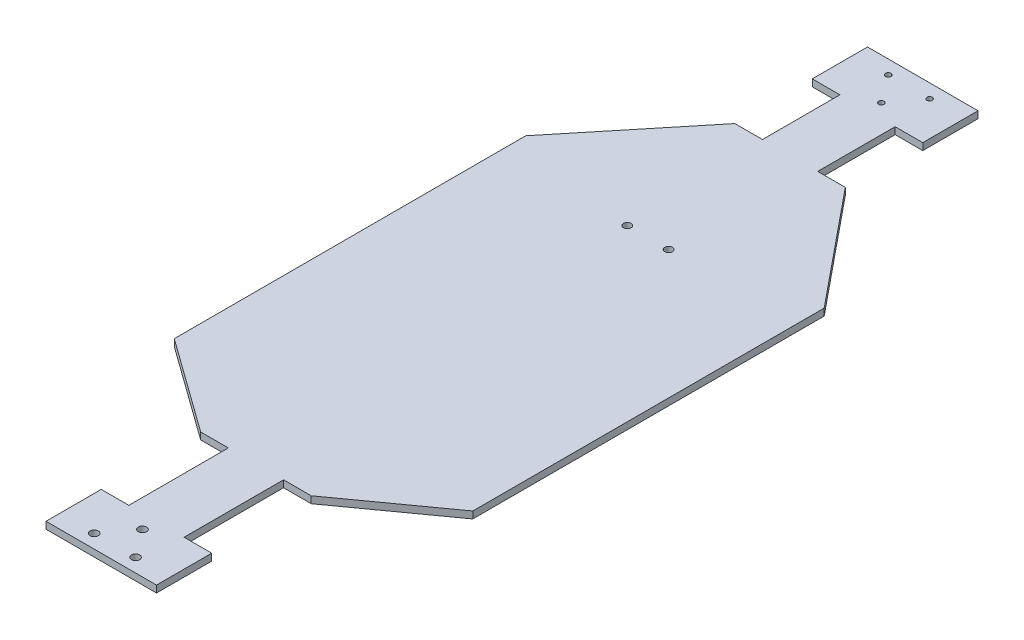
ISO-10303-21;
HEADER;
FILE_DESCRIPTION(('STEP AP214'),'2;1');
FILE_NAME('part.step','',(''),(''),'','','');
FILE_SCHEMA(('AUTOMOTIVE_DESIGN { 1 0 10303 214 1 1 1 1 }'));
ENDSEC;
DATA;
#1=APPLICATION_CONTEXT('core data for automotive mechanical design processes');
#2=APPLICATION_PROTOCOL_DEFINITION('international standard','automotive_design',2000,#1);
#3=PRODUCT_CONTEXT('',#1,'mechanical');
#4=PRODUCT('Part','Part','',(#3));
#5=PRODUCT_RELATED_PRODUCT_CATEGORY('part','',(#4));
#6=PRODUCT_DEFINITION_FORMATION('','',#4);
#7=PRODUCT_DEFINITION_CONTEXT('part definition',#1,'design');
#8=PRODUCT_DEFINITION('design','',#6,#7);
#9=PRODUCT_DEFINITION_SHAPE('','',#8);
#10=(LENGTH_UNIT() NAMED_UNIT(*) SI_UNIT(.MILLI.,.METRE.));
#11=(NAMED_UNIT(*) PLANE_ANGLE_UNIT() SI_UNIT($,.RADIAN.));
#12=(NAMED_UNIT(*) SI_UNIT($,.STERADIAN.) SOLID_ANGLE_UNIT());
#13=UNCERTAINTY_MEASURE_WITH_UNIT(LENGTH_MEASURE(1.E-05),#10,'distance_accuracy_value','');
#14=(GEOMETRIC_REPRESENTATION_CONTEXT(3) GLOBAL_UNCERTAINTY_ASSIGNED_CONTEXT((#13)) GLOBAL_UNIT_ASSIGNED_CONTEXT((#10,
#11,#12)) REPRESENTATION_CONTEXT('',''));
#15=CARTESIAN_POINT('',(0.,0.,0.));
#16=DIRECTION('',(0.,0.,1.));
#17=DIRECTION('',(1.,0.,0.));
#18=AXIS2_PLACEMENT_3D('',#15,#16,#17);
#19=CARTESIAN_POINT('',(-25.3999999999999,3.175,126.133371864142));
#20=DIRECTION('',(0.,-1.,0.));
#21=DIRECTION('',(0.,0.,-1.));
#22=AXIS2_PLACEMENT_3D('',#19,#20,#21);
#23=PLANE('',#22);
#24=CARTESIAN_POINT('',(-9.52499999999995,3.175,-99.829892630849));
#25=DIRECTION('',(0.,1.,0.));
#26=DIRECTION('',(0.,0.,1.));
#27=AXIS2_PLACEMENT_3D('',#24,#25,#26);
#28=CIRCLE('',#27,1.776231011829);
#29=CARTESIAN_POINT('',(-9.52499999999995,3.175,-98.05366161902));
#30=VERTEX_POINT('',#29);
#31=EDGE_CURVE('E464',#30,#30,#28,.T.);
#32=ORIENTED_EDGE('',*,*,#31,.F.);
#33=EDGE_LOOP('',(#32));
#34=FACE_BOUND('',#33,.T.);
#35=CARTESIAN_POINT('',(4.37150315946155E-13,3.175,132.579330515667));
#36=DIRECTION('',(0.,1.,0.));
#37=DIRECTION('',(0.,0.,1.));
#38=AXIS2_PLACEMENT_3D('',#35,#36,#37);
#39=CIRCLE('',#38,1.90499999999991);
#40=CARTESIAN_POINT('',(4.37150315946155E-13,3.175,134.484330515667));
#41=VERTEX_POINT('',#40);
#42=EDGE_CURVE('E476',#41,#41,#39,.T.);
#43=ORIENTED_EDGE('',*,*,#42,.F.);
#44=EDGE_LOOP('',(#43));
#45=FACE_BOUND('',#44,.T.);
#46=CARTESIAN_POINT('',(0.,3.175,-207.145669484333));
#47=DIRECTION('',(0.,1.,0.));
#48=DIRECTION('',(0.,0.,1.));
#49=AXIS2_PLACEMENT_3D('',#46,#47,#48);
#50=CIRCLE('',#49,1.25643098330284);
#51=CARTESIAN_POINT('',(0.,3.175,-205.88923850103));
#52=VERTEX_POINT('',#51);
#53=EDGE_CURVE('E488',#52,#52,#50,.T.);
#54=ORIENTED_EDGE('',*,*,#53,.F.);
#55=EDGE_LOOP('',(#54));
#56=FACE_BOUND('',#55,.T.);
#57=CARTESIAN_POINT('',(-9.525,3.175,-219.845669484333));
#58=DIRECTION('',(0.,1.,0.));
#59=DIRECTION('',(0.,0.,1.));
#60=AXIS2_PLACEMENT_3D('',#57,#58,#59);
#61=CIRCLE('',#60,1.25643098330284);
#62=CARTESIAN_POINT('',(-9.525,3.175,-218.58923850103));
#63=VERTEX_POINT('',#62);
#64=EDGE_CURVE('E229',#63,#63,#61,.T.);
#65=ORIENTED_EDGE('',*,*,#64,.F.);
#66=EDGE_LOOP('',(#65));
#67=FACE_BOUND('',#66,.T.);
#68=DIRECTION('',(0.,0.,1.));
#69=VECTOR('',#68,1.);
#70=CARTESIAN_POINT('',(-25.3999999999999,3.175,151.533371864142));
#71=LINE('',#70,#69);
#72=CARTESIAN_POINT('',(-25.3999999999999,3.175,126.133371864142));
#73=VERTEX_POINT('',#72);
#74=CARTESIAN_POINT('',(-25.3999999999999,3.175,151.533371864142));
#75=VERTEX_POINT('',#74);
#76=EDGE_CURVE('E274',#73,#75,#71,.T.);
#77=ORIENTED_EDGE('',*,*,#76,.T.);
#78=DIRECTION('',(1.,0.,0.));
#79=VECTOR('',#78,1.);
#80=CARTESIAN_POINT('',(25.4000000000001,3.175,151.533371864142));
#81=LINE('',#80,#79);
#82=CARTESIAN_POINT('',(25.4000000000001,3.175,151.533371864142));
#83=VERTEX_POINT('',#82);
#84=EDGE_CURVE('E140',#75,#83,#81,.T.);
#85=ORIENTED_EDGE('',*,*,#84,.T.);
#86=DIRECTION('',(0.,0.,-1.));
#87=VECTOR('',#86,1.);
#88=CARTESIAN_POINT('',(25.4000000000001,3.175,151.533371864142));
#89=LINE('',#88,#87);
#90=CARTESIAN_POINT('',(25.3999999999999,3.175,126.133371864142));
#91=VERTEX_POINT('',#90);
#92=EDGE_CURVE('E337',#83,#91,#89,.T.);
#93=ORIENTED_EDGE('',*,*,#92,.T.);
#94=DIRECTION('',(-1.,0.,0.));
#95=VECTOR('',#94,1.);
#96=CARTESIAN_POINT('',(25.3999999999999,3.175,126.133371864142));
#97=LINE('',#96,#95);
#98=CARTESIAN_POINT('',(12.6999999999999,3.175,126.133371864142));
#99=VERTEX_POINT('',#98);
#100=EDGE_CURVE('E356',#91,#99,#97,.T.);
#101=ORIENTED_EDGE('',*,*,#100,.T.);
#102=DIRECTION('',(0.,0.,-1.));
#103=VECTOR('',#102,1.);
#104=CARTESIAN_POINT('',(12.6999999999999,3.175,126.133371864142));
#105=LINE('',#104,#103);
#106=CARTESIAN_POINT('',(12.6999999999999,3.175,80.4133718641424));
#107=VERTEX_POINT('',#106);
#108=EDGE_CURVE('E353',#99,#107,#105,.T.);
#109=ORIENTED_EDGE('',*,*,#108,.T.);
#110=DIRECTION('',(1.,0.,0.));
#111=VECTOR('',#110,1.);
#112=CARTESIAN_POINT('',(12.6999999999999,3.175,80.4133718641424));
#113=LINE('',#112,#111);
#114=CARTESIAN_POINT('',(25.3999999999999,3.175,80.4133718641424));
#115=VERTEX_POINT('',#114);
#116=EDGE_CURVE('E355',#107,#115,#113,.T.);
#117=ORIENTED_EDGE('',*,*,#116,.T.);
#118=DIRECTION('',(0.81178928975706,0.,-0.583950467964303));
#119=VECTOR('',#118,1.);
#120=CARTESIAN_POINT('',(25.3999999999999,3.175,80.4133718641424));
#121=LINE('',#120,#119);
#122=CARTESIAN_POINT('',(68.6199109866888,3.175,49.3236696908044));
#123=VERTEX_POINT('',#122);
#124=EDGE_CURVE('E358',#115,#123,#121,.T.);
#125=ORIENTED_EDGE('',*,*,#124,.T.);
#126=DIRECTION('',(0.,0.,-1.));
#127=VECTOR('',#126,1.);
#128=CARTESIAN_POINT('',(68.6199109866888,3.175,49.3236696908044));
#129=LINE('',#128,#127);
#130=CARTESIAN_POINT('',(68.6199109866888,3.175,-112.251832625839));
#131=VERTEX_POINT('',#130);
#132=EDGE_CURVE('E364',#123,#131,#129,.T.);
#133=ORIENTED_EDGE('',*,*,#132,.T.);
#134=DIRECTION('',(-0.632396488026637,0.,-0.77464487472104));
#135=VECTOR('',#134,1.);
#136=CARTESIAN_POINT('',(68.6199109866888,3.175,-112.251832625839));
#137=LINE('',#136,#135);
#138=CARTESIAN_POINT('',(25.4,3.175,-165.193433608177));
#139=VERTEX_POINT('',#138);
#140=EDGE_CURVE('E366',#131,#139,#137,.T.);
#141=ORIENTED_EDGE('',*,*,#140,.T.);
#142=DIRECTION('',(-1.,0.,0.));
#143=VECTOR('',#142,1.);
#144=CARTESIAN_POINT('',(25.4,3.175,-165.193433608177));
#145=LINE('',#144,#143);
#146=CARTESIAN_POINT('',(12.7,3.175,-165.193433608177));
#147=VERTEX_POINT('',#146);
#148=EDGE_CURVE('E368',#139,#147,#145,.T.);
#149=ORIENTED_EDGE('',*,*,#148,.T.);
#150=DIRECTION('',(0.,0.,-1.));
#151=VECTOR('',#150,1.);
#152=CARTESIAN_POINT('',(12.7,3.175,-165.193433608177));
#153=LINE('',#152,#151);
#154=CARTESIAN_POINT('',(12.7000000000001,3.175,-200.795669484333));
#155=VERTEX_POINT('',#154);
#156=EDGE_CURVE('E370',#147,#155,#153,.T.);
#157=ORIENTED_EDGE('',*,*,#156,.T.);
#158=DIRECTION('',(1.,0.,0.));
#159=VECTOR('',#158,1.);
#160=CARTESIAN_POINT('',(12.7000000000001,3.175,-200.795669484333));
#161=LINE('',#160,#159);
#162=CARTESIAN_POINT('',(25.3999999999999,3.175,-200.795669484333));
#163=VERTEX_POINT('',#162);
#164=EDGE_CURVE('E372',#155,#163,#161,.T.);
#165=ORIENTED_EDGE('',*,*,#164,.T.);
#166=DIRECTION('',(0.,0.,-1.));
#167=VECTOR('',#166,1.);
#168=CARTESIAN_POINT('',(25.3999999999999,3.175,-200.795669484333));
#169=LINE('',#168,#167);
#170=CARTESIAN_POINT('',(25.3999999999999,3.175,-226.195669484333));
#171=VERTEX_POINT('',#170);
#172=EDGE_CURVE('E374',#163,#171,#169,.T.);
#173=ORIENTED_EDGE('',*,*,#172,.T.);
#174=DIRECTION('',(-1.,0.,0.));
#175=VECTOR('',#174,1.);
#176=CARTESIAN_POINT('',(-25.3999999999999,3.175,-226.195669484333));
#177=LINE('',#176,#175);
#178=CARTESIAN_POINT('',(-25.3999999999999,3.175,-226.195669484333));
#179=VERTEX_POINT('',#178);
#180=EDGE_CURVE('E376',#171,#179,#177,.T.);
#181=ORIENTED_EDGE('',*,*,#180,.T.);
#182=DIRECTION('',(0.,0.,1.));
#183=VECTOR('',#182,1.);
#184=CARTESIAN_POINT('',(-25.3999999999999,3.175,-200.795669484333));
#185=LINE('',#184,#183);
#186=CARTESIAN_POINT('',(-25.3999999999999,3.175,-200.795669484333));
#187=VERTEX_POINT('',#186);
#188=EDGE_CURVE('E378',#179,#187,#185,.T.);
#189=ORIENTED_EDGE('',*,*,#188,.T.);
#190=DIRECTION('',(1.,0.,0.));
#191=VECTOR('',#190,1.);
#192=CARTESIAN_POINT('',(-12.7000000000001,3.175,-200.795669484333));
#193=LINE('',#192,#191);
#194=CARTESIAN_POINT('',(-12.7000000000001,3.175,-200.795669484333));
#195=VERTEX_POINT('',#194);
#196=EDGE_CURVE('E380',#187,#195,#193,.T.);
#197=ORIENTED_EDGE('',*,*,#196,.T.);
#198=DIRECTION('',(0.,0.,1.));
#199=VECTOR('',#198,1.);
#200=CARTESIAN_POINT('',(-12.7,3.175,-165.193433608177));
#201=LINE('',#200,#199);
#202=CARTESIAN_POINT('',(-12.7,3.175,-165.193433608177));
#203=VERTEX_POINT('',#202);
#204=EDGE_CURVE('E382',#195,#203,#201,.T.);
#205=ORIENTED_EDGE('',*,*,#204,.T.);
#206=DIRECTION('',(-1.,0.,0.));
#207=VECTOR('',#206,1.);
#208=CARTESIAN_POINT('',(-25.4,3.175,-165.193433608177));
#209=LINE('',#208,#207);
#210=CARTESIAN_POINT('',(-25.4,3.175,-165.193433608177));
#211=VERTEX_POINT('',#210);
#212=EDGE_CURVE('E384',#203,#211,#209,.T.);
#213=ORIENTED_EDGE('',*,*,#212,.T.);
#214=DIRECTION('',(-0.632396488026636,0.,0.77464487472104));
#215=VECTOR('',#214,1.);
#216=CARTESIAN_POINT('',(-68.6199109866888,3.175,-112.251832625839));
#217=LINE('',#216,#215);
#218=CARTESIAN_POINT('',(-68.6199109866888,3.175,-112.251832625839));
#219=VERTEX_POINT('',#218);
#220=EDGE_CURVE('E386',#211,#219,#217,.T.);
#221=ORIENTED_EDGE('',*,*,#220,.T.);
#222=DIRECTION('',(0.,0.,1.));
#223=VECTOR('',#222,1.);
#224=CARTESIAN_POINT('',(-68.6199109866886,3.175,0.));
#225=LINE('',#224,#223);
#226=CARTESIAN_POINT('',(-68.6199109866888,3.175,49.3236696908044));
#227=VERTEX_POINT('',#226);
#228=EDGE_CURVE('E388',#219,#227,#225,.T.);
#229=ORIENTED_EDGE('',*,*,#228,.T.);
#230=DIRECTION('',(0.81178928975706,0.,0.583950467964303));
#231=VECTOR('',#230,1.);
#232=CARTESIAN_POINT('',(-25.3999999999999,3.175,80.4133718641424));
#233=LINE('',#232,#231);
#234=CARTESIAN_POINT('',(-25.3999999999999,3.175,80.4133718641424));
#235=VERTEX_POINT('',#234);
#236=EDGE_CURVE('E207',#227,#235,#233,.T.);
#237=ORIENTED_EDGE('',*,*,#236,.T.);
#238=DIRECTION('',(1.,0.,0.));
#239=VECTOR('',#238,1.);
#240=CARTESIAN_POINT('',(-12.6999999999999,3.175,80.4133718641424));
#241=LINE('',#240,#239);
#242=CARTESIAN_POINT('',(-12.6999999999999,3.175,80.4133718641424));
#243=VERTEX_POINT('',#242);
#244=EDGE_CURVE('E201',#235,#243,#241,.T.);
#245=ORIENTED_EDGE('',*,*,#244,.T.);
#246=DIRECTION('',(0.,0.,1.));
#247=VECTOR('',#246,1.);
#248=CARTESIAN_POINT('',(-12.6999999999999,3.175,126.133371864142));
#249=LINE('',#248,#247);
#250=CARTESIAN_POINT('',(-12.6999999999999,3.175,126.133371864142));
#251=VERTEX_POINT('',#250);
#252=EDGE_CURVE('E205',#243,#251,#249,.T.);
#253=ORIENTED_EDGE('',*,*,#252,.T.);
#254=DIRECTION('',(-1.,0.,0.));
#255=VECTOR('',#254,1.);
#256=CARTESIAN_POINT('',(-25.3999999999999,3.175,126.133371864142));
#257=LINE('',#256,#255);
#258=EDGE_CURVE('E49',#251,#73,#257,.T.);
#259=ORIENTED_EDGE('',*,*,#258,.T.);
#260=EDGE_LOOP('',(#77,#85,#93,#101,#109,#117,#125,#133,#141,#149,#157,#165,#173,#181,#189,#197,
#205,#213,#221,#229,#237,#245,#253,#259));
#261=FACE_BOUND('',#260,.T.);
#262=CARTESIAN_POINT('',(9.525,3.175,-219.845669484333));
#263=DIRECTION('',(0.,1.,0.));
#264=DIRECTION('',(0.,0.,1.));
#265=AXIS2_PLACEMENT_3D('',#262,#263,#264);
#266=CIRCLE('',#265,1.25643098330284);
#267=CARTESIAN_POINT('',(9.525,3.175,-218.58923850103));
#268=VERTEX_POINT('',#267);
#269=EDGE_CURVE('E494',#268,#268,#266,.T.);
#270=ORIENTED_EDGE('',*,*,#269,.F.);
#271=EDGE_LOOP('',(#270));
#272=FACE_BOUND('',#271,.T.);
#273=CARTESIAN_POINT('',(9.52500000000044,3.175,145.279330515667));
#274=DIRECTION('',(0.,1.,0.));
#275=DIRECTION('',(0.,0.,1.));
#276=AXIS2_PLACEMENT_3D('',#273,#274,#275);
#277=CIRCLE('',#276,1.90499999999993);
#278=CARTESIAN_POINT('',(9.52500000000044,3.175,147.184330515667));
#279=VERTEX_POINT('',#278);
#280=EDGE_CURVE('E482',#279,#279,#277,.T.);
#281=ORIENTED_EDGE('',*,*,#280,.F.);
#282=EDGE_LOOP('',(#281));
#283=FACE_BOUND('',#282,.T.);
#284=CARTESIAN_POINT('',(-9.52499999999957,3.175,145.279330515667));
#285=DIRECTION('',(0.,1.,0.));
#286=DIRECTION('',(0.,0.,1.));
#287=AXIS2_PLACEMENT_3D('',#284,#285,#286);
#288=CIRCLE('',#287,1.90499999999993);
#289=CARTESIAN_POINT('',(-9.52499999999957,3.175,147.184330515667));
#290=VERTEX_POINT('',#289);
#291=EDGE_CURVE('E470',#290,#290,#288,.T.);
#292=ORIENTED_EDGE('',*,*,#291,.F.);
#293=EDGE_LOOP('',(#292));
#294=FACE_BOUND('',#293,.T.);
#295=CARTESIAN_POINT('',(9.52499999999998,3.175,-99.829892630849));
#296=DIRECTION('',(0.,1.,0.));
#297=DIRECTION('',(0.,0.,1.));
#298=AXIS2_PLACEMENT_3D('',#295,#296,#297);
#299=CIRCLE('',#298,1.776231011829);
#300=CARTESIAN_POINT('',(9.52499999999998,3.175,-98.05366161902));
#301=VERTEX_POINT('',#300);
#302=EDGE_CURVE('E455',#301,#301,#299,.T.);
#303=ORIENTED_EDGE('',*,*,#302,.F.);
#304=EDGE_LOOP('',(#303));
#305=FACE_BOUND('',#304,.T.);
#306=ADVANCED_FACE('F32',(#34,#45,#56,#67,#261,#272,#283,#294,#305),#23,.F.);
#307=CARTESIAN_POINT('',(-25.3999999999999,0.,126.133371864142));
#308=DIRECTION('',(0.,-1.,0.));
#309=DIRECTION('',(0.,0.,-1.));
#310=AXIS2_PLACEMENT_3D('',#307,#308,#309);
#311=PLANE('',#310);
#312=CARTESIAN_POINT('',(-9.52499999999995,0.,-99.829892630849));
#313=DIRECTION('',(0.,1.,0.));
#314=DIRECTION('',(0.,0.,1.));
#315=AXIS2_PLACEMENT_3D('',#312,#313,#314);
#316=CIRCLE('',#315,1.776231011829);
#317=CARTESIAN_POINT('',(-9.52499999999995,0.,-98.05366161902));
#318=VERTEX_POINT('',#317);
#319=EDGE_CURVE('E461',#318,#318,#316,.T.);
#320=ORIENTED_EDGE('',*,*,#319,.T.);
#321=EDGE_LOOP('',(#320));
#322=FACE_BOUND('',#321,.T.);
#323=CARTESIAN_POINT('',(4.37150315946155E-13,0.,132.579330515667));
#324=DIRECTION('',(0.,1.,0.));
#325=DIRECTION('',(0.,0.,1.));
#326=AXIS2_PLACEMENT_3D('',#323,#324,#325);
#327=CIRCLE('',#326,1.90499999999991);
#328=CARTESIAN_POINT('',(4.37150315946155E-13,0.,134.484330515667));
#329=VERTEX_POINT('',#328);
#330=EDGE_CURVE('E473',#329,#329,#327,.T.);
#331=ORIENTED_EDGE('',*,*,#330,.T.);
#332=EDGE_LOOP('',(#331));
#333=FACE_BOUND('',#332,.T.);
#334=CARTESIAN_POINT('',(0.,0.,-207.145669484333));
#335=DIRECTION('',(0.,1.,0.));
#336=DIRECTION('',(0.,0.,1.));
#337=AXIS2_PLACEMENT_3D('',#334,#335,#336);
#338=CIRCLE('',#337,1.25643098330284);
#339=CARTESIAN_POINT('',(0.,0.,-205.88923850103));
#340=VERTEX_POINT('',#339);
#341=EDGE_CURVE('E485',#340,#340,#338,.T.);
#342=ORIENTED_EDGE('',*,*,#341,.T.);
#343=EDGE_LOOP('',(#342));
#344=FACE_BOUND('',#343,.T.);
#345=CARTESIAN_POINT('',(-9.525,0.,-219.845669484333));
#346=DIRECTION('',(0.,1.,0.));
#347=DIRECTION('',(0.,0.,1.));
#348=AXIS2_PLACEMENT_3D('',#345,#346,#347);
#349=CIRCLE('',#348,1.25643098330284);
#350=CARTESIAN_POINT('',(-9.525,0.,-218.58923850103));
#351=VERTEX_POINT('',#350);
#352=EDGE_CURVE('E497',#351,#351,#349,.T.);
#353=ORIENTED_EDGE('',*,*,#352,.T.);
#354=EDGE_LOOP('',(#353));
#355=FACE_BOUND('',#354,.T.);
#356=DIRECTION('',(0.,0.,1.));
#357=VECTOR('',#356,1.);
#358=CARTESIAN_POINT('',(-25.3999999999999,0.,151.533371864142));
#359=LINE('',#358,#357);
#360=CARTESIAN_POINT('',(-25.3999999999999,0.,126.133371864142));
#361=VERTEX_POINT('',#360);
#362=CARTESIAN_POINT('',(-25.3999999999999,0.,151.533371864142));
#363=VERTEX_POINT('',#362);
#364=EDGE_CURVE('E225',#361,#363,#359,.T.);
#365=ORIENTED_EDGE('',*,*,#364,.F.);
#366=DIRECTION('',(-1.,0.,0.));
#367=VECTOR('',#366,1.);
#368=CARTESIAN_POINT('',(-25.3999999999999,0.,126.133371864142));
#369=LINE('',#368,#367);
#370=CARTESIAN_POINT('',(-12.6999999999999,0.,126.133371864142));
#371=VERTEX_POINT('',#370);
#372=EDGE_CURVE('E132',#371,#361,#369,.T.);
#373=ORIENTED_EDGE('',*,*,#372,.F.);
#374=DIRECTION('',(0.,0.,1.));
#375=VECTOR('',#374,1.);
#376=CARTESIAN_POINT('',(-12.6999999999999,0.,126.133371864142));
#377=LINE('',#376,#375);
#378=CARTESIAN_POINT('',(-12.6999999999999,0.,80.4133718641424));
#379=VERTEX_POINT('',#378);
#380=EDGE_CURVE('E126',#379,#371,#377,.T.);
#381=ORIENTED_EDGE('',*,*,#380,.F.);
#382=DIRECTION('',(1.,0.,0.));
#383=VECTOR('',#382,1.);
#384=CARTESIAN_POINT('',(-12.6999999999999,0.,80.4133718641424));
#385=LINE('',#384,#383);
#386=CARTESIAN_POINT('',(-25.3999999999999,0.,80.4133718641424));
#387=VERTEX_POINT('',#386);
#388=EDGE_CURVE('E215',#387,#379,#385,.T.);
#389=ORIENTED_EDGE('',*,*,#388,.F.);
#390=DIRECTION('',(0.81178928975706,0.,0.583950467964303));
#391=VECTOR('',#390,1.);
#392=CARTESIAN_POINT('',(-25.3999999999999,0.,80.4133718641424));
#393=LINE('',#392,#391);
#394=CARTESIAN_POINT('',(-68.6199109866888,0.,49.3236696908044));
#395=VERTEX_POINT('',#394);
#396=EDGE_CURVE('E269',#395,#387,#393,.T.);
#397=ORIENTED_EDGE('',*,*,#396,.F.);
#398=DIRECTION('',(0.,0.,1.));
#399=VECTOR('',#398,1.);
#400=CARTESIAN_POINT('',(-68.6199109866888,0.,49.3236696908044));
#401=LINE('',#400,#399);
#402=CARTESIAN_POINT('',(-68.6199109866888,0.,-112.251832625839));
#403=VERTEX_POINT('',#402);
#404=EDGE_CURVE('E267',#403,#395,#401,.T.);
#405=ORIENTED_EDGE('',*,*,#404,.F.);
#406=DIRECTION('',(-0.632396488026636,0.,0.77464487472104));
#407=VECTOR('',#406,1.);
#408=CARTESIAN_POINT('',(-68.6199109866888,0.,-112.251832625839));
#409=LINE('',#408,#407);
#410=CARTESIAN_POINT('',(-25.4,0.,-165.193433608177));
#411=VERTEX_POINT('',#410);
#412=EDGE_CURVE('E264',#411,#403,#409,.T.);
#413=ORIENTED_EDGE('',*,*,#412,.F.);
#414=DIRECTION('',(-1.,0.,0.));
#415=VECTOR('',#414,1.);
#416=CARTESIAN_POINT('',(-25.4,0.,-165.193433608177));
#417=LINE('',#416,#415);
#418=CARTESIAN_POINT('',(-12.7,0.,-165.193433608177));
#419=VERTEX_POINT('',#418);
#420=EDGE_CURVE('E262',#419,#411,#417,.T.);
#421=ORIENTED_EDGE('',*,*,#420,.F.);
#422=DIRECTION('',(0.,0.,1.));
#423=VECTOR('',#422,1.);
#424=CARTESIAN_POINT('',(-12.7,0.,-165.193433608177));
#425=LINE('',#424,#423);
#426=CARTESIAN_POINT('',(-12.7000000000001,0.,-200.795669484333));
#427=VERTEX_POINT('',#426);
#428=EDGE_CURVE('E260',#427,#419,#425,.T.);
#429=ORIENTED_EDGE('',*,*,#428,.F.);
#430=DIRECTION('',(1.,0.,0.));
#431=VECTOR('',#430,1.);
#432=CARTESIAN_POINT('',(-12.7000000000001,0.,-200.795669484333));
#433=LINE('',#432,#431);
#434=CARTESIAN_POINT('',(-25.3999999999999,0.,-200.795669484333));
#435=VERTEX_POINT('',#434);
#436=EDGE_CURVE('E258',#435,#427,#433,.T.);
#437=ORIENTED_EDGE('',*,*,#436,.F.);
#438=DIRECTION('',(0.,0.,1.));
#439=VECTOR('',#438,1.);
#440=CARTESIAN_POINT('',(-25.3999999999999,0.,-200.795669484333));
#441=LINE('',#440,#439);
#442=CARTESIAN_POINT('',(-25.3999999999999,0.,-226.195669484333));
#443=VERTEX_POINT('',#442);
#444=EDGE_CURVE('E256',#443,#435,#441,.T.);
#445=ORIENTED_EDGE('',*,*,#444,.F.);
#446=DIRECTION('',(-1.,0.,0.));
#447=VECTOR('',#446,1.);
#448=CARTESIAN_POINT('',(-25.3999999999999,0.,-226.195669484333));
#449=LINE('',#448,#447);
#450=CARTESIAN_POINT('',(25.3999999999999,0.,-226.195669484333));
#451=VERTEX_POINT('',#450);
#452=EDGE_CURVE('E254',#451,#443,#449,.T.);
#453=ORIENTED_EDGE('',*,*,#452,.F.);
#454=DIRECTION('',(0.,0.,-1.));
#455=VECTOR('',#454,1.);
#456=CARTESIAN_POINT('',(25.3999999999999,0.,-200.795669484333));
#457=LINE('',#456,#455);
#458=CARTESIAN_POINT('',(25.3999999999999,0.,-200.795669484333));
#459=VERTEX_POINT('',#458);
#460=EDGE_CURVE('E252',#459,#451,#457,.T.);
#461=ORIENTED_EDGE('',*,*,#460,.F.);
#462=DIRECTION('',(1.,0.,0.));
#463=VECTOR('',#462,1.);
#464=CARTESIAN_POINT('',(12.7000000000001,0.,-200.795669484333));
#465=LINE('',#464,#463);
#466=CARTESIAN_POINT('',(12.7000000000001,0.,-200.795669484333));
#467=VERTEX_POINT('',#466);
#468=EDGE_CURVE('E250',#467,#459,#465,.T.);
#469=ORIENTED_EDGE('',*,*,#468,.F.);
#470=DIRECTION('',(0.,0.,-1.));
#471=VECTOR('',#470,1.);
#472=CARTESIAN_POINT('',(12.7,0.,-165.193433608177));
#473=LINE('',#472,#471);
#474=CARTESIAN_POINT('',(12.7,0.,-165.193433608177));
#475=VERTEX_POINT('',#474);
#476=EDGE_CURVE('E248',#475,#467,#473,.T.);
#477=ORIENTED_EDGE('',*,*,#476,.F.);
#478=DIRECTION('',(-1.,0.,0.));
#479=VECTOR('',#478,1.);
#480=CARTESIAN_POINT('',(25.4,0.,-165.193433608177));
#481=LINE('',#480,#479);
#482=CARTESIAN_POINT('',(25.4,0.,-165.193433608177));
#483=VERTEX_POINT('',#482);
#484=EDGE_CURVE('E246',#483,#475,#481,.T.);
#485=ORIENTED_EDGE('',*,*,#484,.F.);
#486=DIRECTION('',(-0.632396488026637,0.,-0.77464487472104));
#487=VECTOR('',#486,1.);
#488=CARTESIAN_POINT('',(68.6199109866888,0.,-112.251832625839));
#489=LINE('',#488,#487);
#490=CARTESIAN_POINT('',(68.6199109866888,0.,-112.251832625839));
#491=VERTEX_POINT('',#490);
#492=EDGE_CURVE('E244',#491,#483,#489,.T.);
#493=ORIENTED_EDGE('',*,*,#492,.F.);
#494=DIRECTION('',(0.,0.,-1.));
#495=VECTOR('',#494,1.);
#496=CARTESIAN_POINT('',(68.6199109866886,0.,0.));
#497=LINE('',#496,#495);
#498=CARTESIAN_POINT('',(68.6199109866888,0.,49.3236696908044));
#499=VERTEX_POINT('',#498);
#500=EDGE_CURVE('E242',#499,#491,#497,.T.);
#501=ORIENTED_EDGE('',*,*,#500,.F.);
#502=DIRECTION('',(0.81178928975706,0.,-0.583950467964303));
#503=VECTOR('',#502,1.);
#504=CARTESIAN_POINT('',(25.3999999999999,0.,80.4133718641424));
#505=LINE('',#504,#503);
#506=CARTESIAN_POINT('',(25.3999999999999,0.,80.4133718641424));
#507=VERTEX_POINT('',#506);
#508=EDGE_CURVE('E239',#507,#499,#505,.T.);
#509=ORIENTED_EDGE('',*,*,#508,.F.);
#510=DIRECTION('',(1.,0.,0.));
#511=VECTOR('',#510,1.);
#512=CARTESIAN_POINT('',(12.6999999999999,0.,80.4133718641424));
#513=LINE('',#512,#511);
#514=CARTESIAN_POINT('',(12.6999999999999,0.,80.4133718641424));
#515=VERTEX_POINT('',#514);
#516=EDGE_CURVE('E237',#515,#507,#513,.T.);
#517=ORIENTED_EDGE('',*,*,#516,.F.);
#518=DIRECTION('',(0.,0.,-1.));
#519=VECTOR('',#518,1.);
#520=CARTESIAN_POINT('',(12.6999999999999,0.,126.133371864142));
#521=LINE('',#520,#519);
#522=CARTESIAN_POINT('',(12.6999999999999,0.,126.133371864142));
#523=VERTEX_POINT('',#522);
#524=EDGE_CURVE('E235',#523,#515,#521,.T.);
#525=ORIENTED_EDGE('',*,*,#524,.F.);
#526=DIRECTION('',(-1.,0.,0.));
#527=VECTOR('',#526,1.);
#528=CARTESIAN_POINT('',(25.3999999999999,0.,126.133371864142));
#529=LINE('',#528,#527);
#530=CARTESIAN_POINT('',(25.3999999999999,0.,126.133371864142));
#531=VERTEX_POINT('',#530);
#532=EDGE_CURVE('E233',#531,#523,#529,.T.);
#533=ORIENTED_EDGE('',*,*,#532,.F.);
#534=DIRECTION('',(0.,0.,-1.));
#535=VECTOR('',#534,1.);
#536=CARTESIAN_POINT('',(25.4000000000001,0.,151.533371864142));
#537=LINE('',#536,#535);
#538=CARTESIAN_POINT('',(25.4000000000001,0.,151.533371864142));
#539=VERTEX_POINT('',#538);
#540=EDGE_CURVE('E231',#539,#531,#537,.T.);
#541=ORIENTED_EDGE('',*,*,#540,.F.);
#542=DIRECTION('',(1.,0.,0.));
#543=VECTOR('',#542,1.);
#544=CARTESIAN_POINT('',(25.4000000000001,0.,151.533371864142));
#545=LINE('',#544,#543);
#546=EDGE_CURVE('E228',#363,#539,#545,.T.);
#547=ORIENTED_EDGE('',*,*,#546,.F.);
#548=EDGE_LOOP('',(#365,#373,#381,#389,#397,#405,#413,#421,#429,#437,#445,#453,#461,#469,#477,
#485,#493,#501,#509,#517,#525,#533,#541,#547));
#549=FACE_BOUND('',#548,.T.);
#550=CARTESIAN_POINT('',(9.525,0.,-219.845669484333));
#551=DIRECTION('',(0.,1.,0.));
#552=DIRECTION('',(0.,0.,1.));
#553=AXIS2_PLACEMENT_3D('',#550,#551,#552);
#554=CIRCLE('',#553,1.25643098330284);
#555=CARTESIAN_POINT('',(9.525,0.,-218.58923850103));
#556=VERTEX_POINT('',#555);
#557=EDGE_CURVE('E491',#556,#556,#554,.T.);
#558=ORIENTED_EDGE('',*,*,#557,.T.);
#559=EDGE_LOOP('',(#558));
#560=FACE_BOUND('',#559,.T.);
#561=CARTESIAN_POINT('',(9.52500000000044,0.,145.279330515667));
#562=DIRECTION('',(0.,1.,0.));
#563=DIRECTION('',(0.,0.,1.));
#564=AXIS2_PLACEMENT_3D('',#561,#562,#563);
#565=CIRCLE('',#564,1.90499999999993);
#566=CARTESIAN_POINT('',(9.52500000000044,0.,147.184330515667));
#567=VERTEX_POINT('',#566);
#568=EDGE_CURVE('E479',#567,#567,#565,.T.);
#569=ORIENTED_EDGE('',*,*,#568,.T.);
#570=EDGE_LOOP('',(#569));
#571=FACE_BOUND('',#570,.T.);
#572=CARTESIAN_POINT('',(-9.52499999999957,0.,145.279330515667));
#573=DIRECTION('',(0.,1.,0.));
#574=DIRECTION('',(0.,0.,1.));
#575=AXIS2_PLACEMENT_3D('',#572,#573,#574);
#576=CIRCLE('',#575,1.90499999999993);
#577=CARTESIAN_POINT('',(-9.52499999999957,0.,147.184330515667));
#578=VERTEX_POINT('',#577);
#579=EDGE_CURVE('E467',#578,#578,#576,.T.);
#580=ORIENTED_EDGE('',*,*,#579,.T.);
#581=EDGE_LOOP('',(#580));
#582=FACE_BOUND('',#581,.T.);
#583=CARTESIAN_POINT('',(9.52499999999998,0.,-99.829892630849));
#584=DIRECTION('',(0.,1.,0.));
#585=DIRECTION('',(0.,0.,1.));
#586=AXIS2_PLACEMENT_3D('',#583,#584,#585);
#587=CIRCLE('',#586,1.776231011829);
#588=CARTESIAN_POINT('',(9.52499999999998,0.,-98.05366161902));
#589=VERTEX_POINT('',#588);
#590=EDGE_CURVE('E458',#589,#589,#587,.T.);
#591=ORIENTED_EDGE('',*,*,#590,.T.);
#592=EDGE_LOOP('',(#591));
#593=FACE_BOUND('',#592,.T.);
#594=ADVANCED_FACE('F341',(#322,#333,#344,#355,#549,#560,#571,#582,#593),#311,.T.);
#595=CARTESIAN_POINT('',(-25.3999999999999,3.175,151.533371864142));
#596=DIRECTION('',(1.,0.,0.));
#597=DIRECTION('',(0.,0.,-1.));
#598=AXIS2_PLACEMENT_3D('',#595,#596,#597);
#599=PLANE('',#598);
#600=ORIENTED_EDGE('',*,*,#364,.T.);
#601=DIRECTION('',(0.,-1.,0.));
#602=VECTOR('',#601,1.);
#603=CARTESIAN_POINT('',(-25.3999999999999,3.175,151.533371864142));
#604=LINE('',#603,#602);
#605=EDGE_CURVE('E11',#75,#363,#604,.T.);
#606=ORIENTED_EDGE('',*,*,#605,.F.);
#607=ORIENTED_EDGE('',*,*,#76,.F.);
#608=DIRECTION('',(0.,-1.,0.));
#609=VECTOR('',#608,1.);
#610=CARTESIAN_POINT('',(-25.3999999999999,3.175,126.133371864142));
#611=LINE('',#610,#609);
#612=EDGE_CURVE('E221',#73,#361,#611,.T.);
#613=ORIENTED_EDGE('',*,*,#612,.T.);
#614=EDGE_LOOP('',(#600,#606,#607,#613));
#615=FACE_BOUND('',#614,.T.);
#616=ADVANCED_FACE('F34',(#615),#599,.F.);
#617=CARTESIAN_POINT('',(25.4000000000001,3.175,151.533371864142));
#618=DIRECTION('',(0.,0.,-1.));
#619=DIRECTION('',(-1.,0.,0.));
#620=AXIS2_PLACEMENT_3D('',#617,#618,#619);
#621=PLANE('',#620);
#622=ORIENTED_EDGE('',*,*,#546,.T.);
#623=DIRECTION('',(0.,-1.,0.));
#624=VECTOR('',#623,1.);
#625=CARTESIAN_POINT('',(25.4000000000001,3.175,151.533371864142));
#626=LINE('',#625,#624);
#627=EDGE_CURVE('E41',#83,#539,#626,.T.);
#628=ORIENTED_EDGE('',*,*,#627,.F.);
#629=ORIENTED_EDGE('',*,*,#84,.F.);
#630=ORIENTED_EDGE('',*,*,#605,.T.);
#631=EDGE_LOOP('',(#622,#628,#629,#630));
#632=FACE_BOUND('',#631,.T.);
#633=ADVANCED_FACE('F764',(#632),#621,.F.);
#634=CARTESIAN_POINT('',(25.4000000000001,3.175,151.533371864142));
#635=DIRECTION('',(-1.,0.,0.));
#636=DIRECTION('',(0.,0.,1.));
#637=AXIS2_PLACEMENT_3D('',#634,#635,#636);
#638=PLANE('',#637);
#639=ORIENTED_EDGE('',*,*,#540,.T.);
#640=DIRECTION('',(0.,-1.,0.));
#641=VECTOR('',#640,1.);
#642=CARTESIAN_POINT('',(25.3999999999999,3.175,126.133371864142));
#643=LINE('',#642,#641);
#644=EDGE_CURVE('E329',#91,#531,#643,.T.);
#645=ORIENTED_EDGE('',*,*,#644,.F.);
#646=ORIENTED_EDGE('',*,*,#92,.F.);
#647=ORIENTED_EDGE('',*,*,#627,.T.);
#648=EDGE_LOOP('',(#639,#645,#646,#647));
#649=FACE_BOUND('',#648,.T.);
#650=ADVANCED_FACE('F335',(#649),#638,.F.);
#651=CARTESIAN_POINT('',(25.3999999999999,3.175,126.133371864142));
#652=DIRECTION('',(0.,0.,1.));
#653=DIRECTION('',(1.,0.,0.));
#654=AXIS2_PLACEMENT_3D('',#651,#652,#653);
#655=PLANE('',#654);
#656=ORIENTED_EDGE('',*,*,#532,.T.);
#657=DIRECTION('',(0.,-1.,0.));
#658=VECTOR('',#657,1.);
#659=CARTESIAN_POINT('',(12.6999999999999,3.175,126.133371864142));
#660=LINE('',#659,#658);
#661=EDGE_CURVE('E326',#99,#523,#660,.T.);
#662=ORIENTED_EDGE('',*,*,#661,.F.);
#663=ORIENTED_EDGE('',*,*,#100,.F.);
#664=ORIENTED_EDGE('',*,*,#644,.T.);
#665=EDGE_LOOP('',(#656,#662,#663,#664));
#666=FACE_BOUND('',#665,.T.);
#667=ADVANCED_FACE('F347',(#666),#655,.F.);
#668=CARTESIAN_POINT('',(12.6999999999999,3.175,126.133371864142));
#669=DIRECTION('',(-1.,0.,0.));
#670=DIRECTION('',(0.,0.,1.));
#671=AXIS2_PLACEMENT_3D('',#668,#669,#670);
#672=PLANE('',#671);
#673=ORIENTED_EDGE('',*,*,#524,.T.);
#674=DIRECTION('',(0.,-1.,0.));
#675=VECTOR('',#674,1.);
#676=CARTESIAN_POINT('',(12.6999999999999,3.175,80.4133718641424));
#677=LINE('',#676,#675);
#678=EDGE_CURVE('E323',#107,#515,#677,.T.);
#679=ORIENTED_EDGE('',*,*,#678,.F.);
#680=ORIENTED_EDGE('',*,*,#108,.F.);
#681=ORIENTED_EDGE('',*,*,#661,.T.);
#682=EDGE_LOOP('',(#673,#679,#680,#681));
#683=FACE_BOUND('',#682,.T.);
#684=ADVANCED_FACE('F351',(#683),#672,.F.);
#685=CARTESIAN_POINT('',(12.6999999999999,3.175,80.4133718641424));
#686=DIRECTION('',(0.,0.,-1.));
#687=DIRECTION('',(-1.,0.,0.));
#688=AXIS2_PLACEMENT_3D('',#685,#686,#687);
#689=PLANE('',#688);
#690=ORIENTED_EDGE('',*,*,#516,.T.);
#691=DIRECTION('',(0.,-1.,0.));
#692=VECTOR('',#691,1.);
#693=CARTESIAN_POINT('',(25.3999999999999,3.175,80.4133718641424));
#694=LINE('',#693,#692);
#695=EDGE_CURVE('E320',#115,#507,#694,.T.);
#696=ORIENTED_EDGE('',*,*,#695,.F.);
#697=ORIENTED_EDGE('',*,*,#116,.F.);
#698=ORIENTED_EDGE('',*,*,#678,.T.);
#699=EDGE_LOOP('',(#690,#696,#697,#698));
#700=FACE_BOUND('',#699,.T.);
#701=ADVANCED_FACE('F729',(#700),#689,.F.);
#702=CARTESIAN_POINT('',(25.3999999999999,3.175,80.4133718641424));
#703=DIRECTION('',(-0.583950467964303,0.,-0.81178928975706));
#704=DIRECTION('',(-0.81178928975706,0.,0.583950467964303));
#705=AXIS2_PLACEMENT_3D('',#702,#703,#704);
#706=PLANE('',#705);
#707=ORIENTED_EDGE('',*,*,#508,.T.);
#708=DIRECTION('',(0.,-1.,0.));
#709=VECTOR('',#708,1.);
#710=CARTESIAN_POINT('',(68.6199109866888,3.175,49.3236696908044));
#711=LINE('',#710,#709);
#712=EDGE_CURVE('E317',#123,#499,#711,.T.);
#713=ORIENTED_EDGE('',*,*,#712,.F.);
#714=ORIENTED_EDGE('',*,*,#124,.F.);
#715=ORIENTED_EDGE('',*,*,#695,.T.);
#716=EDGE_LOOP('',(#707,#713,#714,#715));
#717=FACE_BOUND('',#716,.T.);
#718=ADVANCED_FACE('F718',(#717),#706,.F.);
#719=CARTESIAN_POINT('',(68.6199109866886,3.175,0.));
#720=DIRECTION('',(-1.,0.,0.));
#721=DIRECTION('',(0.,0.,1.));
#722=AXIS2_PLACEMENT_3D('',#719,#720,#721);
#723=PLANE('',#722);
#724=ORIENTED_EDGE('',*,*,#500,.T.);
#725=DIRECTION('',(0.,-1.,0.));
#726=VECTOR('',#725,1.);
#727=CARTESIAN_POINT('',(68.6199109866888,3.175,-112.251832625839));
#728=LINE('',#727,#726);
#729=EDGE_CURVE('E314',#131,#491,#728,.T.);
#730=ORIENTED_EDGE('',*,*,#729,.F.);
#731=ORIENTED_EDGE('',*,*,#132,.F.);
#732=ORIENTED_EDGE('',*,*,#712,.T.);
#733=EDGE_LOOP('',(#724,#730,#731,#732));
#734=FACE_BOUND('',#733,.T.);
#735=ADVANCED_FACE('F708',(#734),#723,.F.);
#736=CARTESIAN_POINT('',(68.6199109866888,3.175,-112.251832625839));
#737=DIRECTION('',(-0.77464487472104,0.,0.632396488026636));
#738=DIRECTION('',(0.632396488026637,0.,0.77464487472104));
#739=AXIS2_PLACEMENT_3D('',#736,#737,#738);
#740=PLANE('',#739);
#741=ORIENTED_EDGE('',*,*,#492,.T.);
#742=DIRECTION('',(0.,-1.,0.));
#743=VECTOR('',#742,1.);
#744=CARTESIAN_POINT('',(25.4,3.175,-165.193433608177));
#745=LINE('',#744,#743);
#746=EDGE_CURVE('E311',#139,#483,#745,.T.);
#747=ORIENTED_EDGE('',*,*,#746,.F.);
#748=ORIENTED_EDGE('',*,*,#140,.F.);
#749=ORIENTED_EDGE('',*,*,#729,.T.);
#750=EDGE_LOOP('',(#741,#747,#748,#749));
#751=FACE_BOUND('',#750,.T.);
#752=ADVANCED_FACE('F698',(#751),#740,.F.);
#753=CARTESIAN_POINT('',(25.4,3.175,-165.193433608177));
#754=DIRECTION('',(0.,0.,1.));
#755=DIRECTION('',(1.,0.,0.));
#756=AXIS2_PLACEMENT_3D('',#753,#754,#755);
#757=PLANE('',#756);
#758=ORIENTED_EDGE('',*,*,#484,.T.);
#759=DIRECTION('',(0.,-1.,0.));
#760=VECTOR('',#759,1.);
#761=CARTESIAN_POINT('',(12.7,3.175,-165.193433608177));
#762=LINE('',#761,#760);
#763=EDGE_CURVE('E308',#147,#475,#762,.T.);
#764=ORIENTED_EDGE('',*,*,#763,.F.);
#765=ORIENTED_EDGE('',*,*,#148,.F.);
#766=ORIENTED_EDGE('',*,*,#746,.T.);
#767=EDGE_LOOP('',(#758,#764,#765,#766));
#768=FACE_BOUND('',#767,.T.);
#769=ADVANCED_FACE('F688',(#768),#757,.F.);
#770=CARTESIAN_POINT('',(12.7,3.175,-165.193433608177));
#771=DIRECTION('',(-1.,0.,0.));
#772=DIRECTION('',(0.,0.,1.));
#773=AXIS2_PLACEMENT_3D('',#770,#771,#772);
#774=PLANE('',#773);
#775=ORIENTED_EDGE('',*,*,#476,.T.);
#776=DIRECTION('',(0.,-1.,0.));
#777=VECTOR('',#776,1.);
#778=CARTESIAN_POINT('',(12.7000000000001,3.175,-200.795669484333));
#779=LINE('',#778,#777);
#780=EDGE_CURVE('E305',#155,#467,#779,.T.);
#781=ORIENTED_EDGE('',*,*,#780,.F.);
#782=ORIENTED_EDGE('',*,*,#156,.F.);
#783=ORIENTED_EDGE('',*,*,#763,.T.);
#784=EDGE_LOOP('',(#775,#781,#782,#783));
#785=FACE_BOUND('',#784,.T.);
#786=ADVANCED_FACE('F678',(#785),#774,.F.);
#787=CARTESIAN_POINT('',(12.7000000000001,3.175,-200.795669484333));
#788=DIRECTION('',(0.,0.,-1.));
#789=DIRECTION('',(-1.,0.,0.));
#790=AXIS2_PLACEMENT_3D('',#787,#788,#789);
#791=PLANE('',#790);
#792=ORIENTED_EDGE('',*,*,#468,.T.);
#793=DIRECTION('',(0.,-1.,0.));
#794=VECTOR('',#793,1.);
#795=CARTESIAN_POINT('',(25.3999999999999,3.175,-200.795669484333));
#796=LINE('',#795,#794);
#797=EDGE_CURVE('E302',#163,#459,#796,.T.);
#798=ORIENTED_EDGE('',*,*,#797,.F.);
#799=ORIENTED_EDGE('',*,*,#164,.F.);
#800=ORIENTED_EDGE('',*,*,#780,.T.);
#801=EDGE_LOOP('',(#792,#798,#799,#800));
#802=FACE_BOUND('',#801,.T.);
#803=ADVANCED_FACE('F668',(#802),#791,.F.);
#804=CARTESIAN_POINT('',(25.3999999999999,3.175,-200.795669484333));
#805=DIRECTION('',(-1.,0.,0.));
#806=DIRECTION('',(0.,0.,1.));
#807=AXIS2_PLACEMENT_3D('',#804,#805,#806);
#808=PLANE('',#807);
#809=ORIENTED_EDGE('',*,*,#460,.T.);
#810=DIRECTION('',(0.,-1.,0.));
#811=VECTOR('',#810,1.);
#812=CARTESIAN_POINT('',(25.3999999999999,3.175,-226.195669484333));
#813=LINE('',#812,#811);
#814=EDGE_CURVE('E299',#171,#451,#813,.T.);
#815=ORIENTED_EDGE('',*,*,#814,.F.);
#816=ORIENTED_EDGE('',*,*,#172,.F.);
#817=ORIENTED_EDGE('',*,*,#797,.T.);
#818=EDGE_LOOP('',(#809,#815,#816,#817));
#819=FACE_BOUND('',#818,.T.);
#820=ADVANCED_FACE('F658',(#819),#808,.F.);
#821=CARTESIAN_POINT('',(-25.3999999999999,3.175,-226.195669484333));
#822=DIRECTION('',(0.,0.,1.));
#823=DIRECTION('',(1.,0.,0.));
#824=AXIS2_PLACEMENT_3D('',#821,#822,#823);
#825=PLANE('',#824);
#826=ORIENTED_EDGE('',*,*,#452,.T.);
#827=DIRECTION('',(0.,-1.,0.));
#828=VECTOR('',#827,1.);
#829=CARTESIAN_POINT('',(-25.3999999999999,3.175,-226.195669484333));
#830=LINE('',#829,#828);
#831=EDGE_CURVE('E296',#179,#443,#830,.T.);
#832=ORIENTED_EDGE('',*,*,#831,.F.);
#833=ORIENTED_EDGE('',*,*,#180,.F.);
#834=ORIENTED_EDGE('',*,*,#814,.T.);
#835=EDGE_LOOP('',(#826,#832,#833,#834));
#836=FACE_BOUND('',#835,.T.);
#837=ADVANCED_FACE('F648',(#836),#825,.F.);
#838=CARTESIAN_POINT('',(-25.3999999999999,3.175,-200.795669484333));
#839=DIRECTION('',(1.,0.,0.));
#840=DIRECTION('',(0.,0.,-1.));
#841=AXIS2_PLACEMENT_3D('',#838,#839,#840);
#842=PLANE('',#841);
#843=ORIENTED_EDGE('',*,*,#444,.T.);
#844=DIRECTION('',(0.,-1.,0.));
#845=VECTOR('',#844,1.);
#846=CARTESIAN_POINT('',(-25.3999999999999,3.175,-200.795669484333));
#847=LINE('',#846,#845);
#848=EDGE_CURVE('E293',#187,#435,#847,.T.);
#849=ORIENTED_EDGE('',*,*,#848,.F.);
#850=ORIENTED_EDGE('',*,*,#188,.F.);
#851=ORIENTED_EDGE('',*,*,#831,.T.);
#852=EDGE_LOOP('',(#843,#849,#850,#851));
#853=FACE_BOUND('',#852,.T.);
#854=ADVANCED_FACE('F638',(#853),#842,.F.);
#855=CARTESIAN_POINT('',(-12.7000000000001,3.175,-200.795669484333));
#856=DIRECTION('',(0.,0.,-1.));
#857=DIRECTION('',(-1.,0.,0.));
#858=AXIS2_PLACEMENT_3D('',#855,#856,#857);
#859=PLANE('',#858);
#860=ORIENTED_EDGE('',*,*,#436,.T.);
#861=DIRECTION('',(0.,-1.,0.));
#862=VECTOR('',#861,1.);
#863=CARTESIAN_POINT('',(-12.7000000000001,3.175,-200.795669484333));
#864=LINE('',#863,#862);
#865=EDGE_CURVE('E290',#195,#427,#864,.T.);
#866=ORIENTED_EDGE('',*,*,#865,.F.);
#867=ORIENTED_EDGE('',*,*,#196,.F.);
#868=ORIENTED_EDGE('',*,*,#848,.T.);
#869=EDGE_LOOP('',(#860,#866,#867,#868));
#870=FACE_BOUND('',#869,.T.);
#871=ADVANCED_FACE('F628',(#870),#859,.F.);
#872=CARTESIAN_POINT('',(-12.7,3.175,-165.193433608177));
#873=DIRECTION('',(1.,0.,0.));
#874=DIRECTION('',(0.,0.,-1.));
#875=AXIS2_PLACEMENT_3D('',#872,#873,#874);
#876=PLANE('',#875);
#877=ORIENTED_EDGE('',*,*,#428,.T.);
#878=DIRECTION('',(0.,-1.,0.));
#879=VECTOR('',#878,1.);
#880=CARTESIAN_POINT('',(-12.7,3.175,-165.193433608177));
#881=LINE('',#880,#879);
#882=EDGE_CURVE('E287',#203,#419,#881,.T.);
#883=ORIENTED_EDGE('',*,*,#882,.F.);
#884=ORIENTED_EDGE('',*,*,#204,.F.);
#885=ORIENTED_EDGE('',*,*,#865,.T.);
#886=EDGE_LOOP('',(#877,#883,#884,#885));
#887=FACE_BOUND('',#886,.T.);
#888=ADVANCED_FACE('F618',(#887),#876,.F.);
#889=CARTESIAN_POINT('',(-25.4,3.175,-165.193433608177));
#890=DIRECTION('',(0.,0.,1.));
#891=DIRECTION('',(1.,0.,0.));
#892=AXIS2_PLACEMENT_3D('',#889,#890,#891);
#893=PLANE('',#892);
#894=ORIENTED_EDGE('',*,*,#420,.T.);
#895=DIRECTION('',(0.,-1.,0.));
#896=VECTOR('',#895,1.);
#897=CARTESIAN_POINT('',(-25.4,3.175,-165.193433608177));
#898=LINE('',#897,#896);
#899=EDGE_CURVE('E284',#211,#411,#898,.T.);
#900=ORIENTED_EDGE('',*,*,#899,.F.);
#901=ORIENTED_EDGE('',*,*,#212,.F.);
#902=ORIENTED_EDGE('',*,*,#882,.T.);
#903=EDGE_LOOP('',(#894,#900,#901,#902));
#904=FACE_BOUND('',#903,.T.);
#905=ADVANCED_FACE('F608',(#904),#893,.F.);
#906=CARTESIAN_POINT('',(-68.6199109866888,3.175,-112.251832625839));
#907=DIRECTION('',(0.774644874721041,0.,0.632396488026636));
#908=DIRECTION('',(0.632396488026636,0.,-0.774644874721041));
#909=AXIS2_PLACEMENT_3D('',#906,#907,#908);
#910=PLANE('',#909);
#911=ORIENTED_EDGE('',*,*,#412,.T.);
#912=DIRECTION('',(0.,-1.,0.));
#913=VECTOR('',#912,1.);
#914=CARTESIAN_POINT('',(-68.6199109866888,3.175,-112.251832625839));
#915=LINE('',#914,#913);
#916=EDGE_CURVE('E281',#219,#403,#915,.T.);
#917=ORIENTED_EDGE('',*,*,#916,.F.);
#918=ORIENTED_EDGE('',*,*,#220,.F.);
#919=ORIENTED_EDGE('',*,*,#899,.T.);
#920=EDGE_LOOP('',(#911,#917,#918,#919));
#921=FACE_BOUND('',#920,.T.);
#922=ADVANCED_FACE('F598',(#921),#910,.F.);
#923=CARTESIAN_POINT('',(-68.6199109866888,3.175,49.3236696908044));
#924=DIRECTION('',(1.,0.,0.));
#925=DIRECTION('',(0.,0.,-1.));
#926=AXIS2_PLACEMENT_3D('',#923,#924,#925);
#927=PLANE('',#926);
#928=ORIENTED_EDGE('',*,*,#404,.T.);
#929=DIRECTION('',(0.,-1.,0.));
#930=VECTOR('',#929,1.);
#931=CARTESIAN_POINT('',(-68.6199109866888,3.175,49.3236696908044));
#932=LINE('',#931,#930);
#933=EDGE_CURVE('E278',#227,#395,#932,.T.);
#934=ORIENTED_EDGE('',*,*,#933,.F.);
#935=ORIENTED_EDGE('',*,*,#228,.F.);
#936=ORIENTED_EDGE('',*,*,#916,.T.);
#937=EDGE_LOOP('',(#928,#934,#935,#936));
#938=FACE_BOUND('',#937,.T.);
#939=ADVANCED_FACE('F394',(#938),#927,.F.);
#940=CARTESIAN_POINT('',(-25.3999999999999,3.175,80.4133718641424));
#941=DIRECTION('',(0.583950467964303,0.,-0.81178928975706));
#942=DIRECTION('',(-0.81178928975706,0.,-0.583950467964303));
#943=AXIS2_PLACEMENT_3D('',#940,#941,#942);
#944=PLANE('',#943);
#945=ORIENTED_EDGE('',*,*,#396,.T.);
#946=DIRECTION('',(0.,-1.,0.));
#947=VECTOR('',#946,1.);
#948=CARTESIAN_POINT('',(-25.3999999999999,3.175,80.4133718641424));
#949=LINE('',#948,#947);
#950=EDGE_CURVE('E216',#235,#387,#949,.T.);
#951=ORIENTED_EDGE('',*,*,#950,.F.);
#952=ORIENTED_EDGE('',*,*,#236,.F.);
#953=ORIENTED_EDGE('',*,*,#933,.T.);
#954=EDGE_LOOP('',(#945,#951,#952,#953));
#955=FACE_BOUND('',#954,.T.);
#956=ADVANCED_FACE('F397',(#955),#944,.F.);
#957=CARTESIAN_POINT('',(-12.6999999999999,3.175,80.4133718641424));
#958=DIRECTION('',(0.,0.,-1.));
#959=DIRECTION('',(-1.,0.,0.));
#960=AXIS2_PLACEMENT_3D('',#957,#958,#959);
#961=PLANE('',#960);
#962=ORIENTED_EDGE('',*,*,#388,.T.);
#963=DIRECTION('',(0.,-1.,0.));
#964=VECTOR('',#963,1.);
#965=CARTESIAN_POINT('',(-12.6999999999999,3.175,80.4133718641424));
#966=LINE('',#965,#964);
#967=EDGE_CURVE('E212',#243,#379,#966,.T.);
#968=ORIENTED_EDGE('',*,*,#967,.F.);
#969=ORIENTED_EDGE('',*,*,#244,.F.);
#970=ORIENTED_EDGE('',*,*,#950,.T.);
#971=EDGE_LOOP('',(#962,#968,#969,#970));
#972=FACE_BOUND('',#971,.T.);
#973=ADVANCED_FACE('F213',(#972),#961,.F.);
#974=CARTESIAN_POINT('',(-12.6999999999999,3.175,126.133371864142));
#975=DIRECTION('',(1.,0.,0.));
#976=DIRECTION('',(0.,0.,-1.));
#977=AXIS2_PLACEMENT_3D('',#974,#975,#976);
#978=PLANE('',#977);
#979=ORIENTED_EDGE('',*,*,#380,.T.);
#980=DIRECTION('',(0.,-1.,0.));
#981=VECTOR('',#980,1.);
#982=CARTESIAN_POINT('',(-12.6999999999999,3.175,126.133371864142));
#983=LINE('',#982,#981);
#984=EDGE_CURVE('E217',#251,#371,#983,.T.);
#985=ORIENTED_EDGE('',*,*,#984,.F.);
#986=ORIENTED_EDGE('',*,*,#252,.F.);
#987=ORIENTED_EDGE('',*,*,#967,.T.);
#988=EDGE_LOOP('',(#979,#985,#986,#987));
#989=FACE_BOUND('',#988,.T.);
#990=ADVANCED_FACE('F219',(#989),#978,.F.);
#991=CARTESIAN_POINT('',(-25.3999999999999,3.175,126.133371864142));
#992=DIRECTION('',(0.,0.,1.));
#993=DIRECTION('',(1.,0.,0.));
#994=AXIS2_PLACEMENT_3D('',#991,#992,#993);
#995=PLANE('',#994);
#996=ORIENTED_EDGE('',*,*,#372,.T.);
#997=ORIENTED_EDGE('',*,*,#612,.F.);
#998=ORIENTED_EDGE('',*,*,#258,.F.);
#999=ORIENTED_EDGE('',*,*,#984,.T.);
#1000=EDGE_LOOP('',(#996,#997,#998,#999));
#1001=FACE_BOUND('',#1000,.T.);
#1002=ADVANCED_FACE('F401',(#1001),#995,.F.);
#1003=CARTESIAN_POINT('',(-9.525,3.175,-219.845669484333));
#1004=DIRECTION('',(0.,-1.,0.));
#1005=DIRECTION('',(0.,0.,-1.));
#1006=AXIS2_PLACEMENT_3D('',#1003,#1004,#1005);
#1007=CYLINDRICAL_SURFACE('',#1006,1.25643098330284);
#1008=ORIENTED_EDGE('',*,*,#64,.T.);
#1009=EDGE_LOOP('',(#1008));
#1010=FACE_BOUND('',#1009,.T.);
#1011=ORIENTED_EDGE('',*,*,#352,.F.);
#1012=EDGE_LOOP('',(#1011));
#1013=FACE_BOUND('',#1012,.T.);
#1014=ADVANCED_FACE('F403',(#1010,#1013),#1007,.F.);
#1015=CARTESIAN_POINT('',(9.525,3.175,-219.845669484333));
#1016=DIRECTION('',(0.,-1.,0.));
#1017=DIRECTION('',(0.,0.,-1.));
#1018=AXIS2_PLACEMENT_3D('',#1015,#1016,#1017);
#1019=CYLINDRICAL_SURFACE('',#1018,1.25643098330284);
#1020=ORIENTED_EDGE('',*,*,#269,.T.);
#1021=EDGE_LOOP('',(#1020));
#1022=FACE_BOUND('',#1021,.T.);
#1023=ORIENTED_EDGE('',*,*,#557,.F.);
#1024=EDGE_LOOP('',(#1023));
#1025=FACE_BOUND('',#1024,.T.);
#1026=ADVANCED_FACE('F409',(#1022,#1025),#1019,.F.);
#1027=CARTESIAN_POINT('',(0.,3.175,-207.145669484333));
#1028=DIRECTION('',(0.,-1.,0.));
#1029=DIRECTION('',(0.,0.,-1.));
#1030=AXIS2_PLACEMENT_3D('',#1027,#1028,#1029);
#1031=CYLINDRICAL_SURFACE('',#1030,1.25643098330284);
#1032=ORIENTED_EDGE('',*,*,#53,.T.);
#1033=EDGE_LOOP('',(#1032));
#1034=FACE_BOUND('',#1033,.T.);
#1035=ORIENTED_EDGE('',*,*,#341,.F.);
#1036=EDGE_LOOP('',(#1035));
#1037=FACE_BOUND('',#1036,.T.);
#1038=ADVANCED_FACE('F426',(#1034,#1037),#1031,.F.);
#1039=CARTESIAN_POINT('',(9.52500000000044,3.175,145.279330515667));
#1040=DIRECTION('',(0.,-1.,0.));
#1041=DIRECTION('',(0.,0.,-1.));
#1042=AXIS2_PLACEMENT_3D('',#1039,#1040,#1041);
#1043=CYLINDRICAL_SURFACE('',#1042,1.90499999999993);
#1044=ORIENTED_EDGE('',*,*,#280,.T.);
#1045=EDGE_LOOP('',(#1044));
#1046=FACE_BOUND('',#1045,.T.);
#1047=ORIENTED_EDGE('',*,*,#568,.F.);
#1048=EDGE_LOOP('',(#1047));
#1049=FACE_BOUND('',#1048,.T.);
#1050=ADVANCED_FACE('F430',(#1046,#1049),#1043,.F.);
#1051=CARTESIAN_POINT('',(4.37150315946155E-13,3.175,132.579330515667));
#1052=DIRECTION('',(0.,-1.,0.));
#1053=DIRECTION('',(0.,0.,-1.));
#1054=AXIS2_PLACEMENT_3D('',#1051,#1052,#1053);
#1055=CYLINDRICAL_SURFACE('',#1054,1.90499999999991);
#1056=ORIENTED_EDGE('',*,*,#42,.T.);
#1057=EDGE_LOOP('',(#1056));
#1058=FACE_BOUND('',#1057,.T.);
#1059=ORIENTED_EDGE('',*,*,#330,.F.);
#1060=EDGE_LOOP('',(#1059));
#1061=FACE_BOUND('',#1060,.T.);
#1062=ADVANCED_FACE('F434',(#1058,#1061),#1055,.F.);
#1063=CARTESIAN_POINT('',(-9.52499999999957,3.175,145.279330515667));
#1064=DIRECTION('',(0.,-1.,0.));
#1065=DIRECTION('',(0.,0.,-1.));
#1066=AXIS2_PLACEMENT_3D('',#1063,#1064,#1065);
#1067=CYLINDRICAL_SURFACE('',#1066,1.90499999999993);
#1068=ORIENTED_EDGE('',*,*,#291,.T.);
#1069=EDGE_LOOP('',(#1068));
#1070=FACE_BOUND('',#1069,.T.);
#1071=ORIENTED_EDGE('',*,*,#579,.F.);
#1072=EDGE_LOOP('',(#1071));
#1073=FACE_BOUND('',#1072,.T.);
#1074=ADVANCED_FACE('F438',(#1070,#1073),#1067,.F.);
#1075=CARTESIAN_POINT('',(-9.52499999999995,3.175,-99.829892630849));
#1076=DIRECTION('',(0.,-1.,0.));
#1077=DIRECTION('',(0.,0.,-1.));
#1078=AXIS2_PLACEMENT_3D('',#1075,#1076,#1077);
#1079=CYLINDRICAL_SURFACE('',#1078,1.776231011829);
#1080=ORIENTED_EDGE('',*,*,#31,.T.);
#1081=EDGE_LOOP('',(#1080));
#1082=FACE_BOUND('',#1081,.T.);
#1083=ORIENTED_EDGE('',*,*,#319,.F.);
#1084=EDGE_LOOP('',(#1083));
#1085=FACE_BOUND('',#1084,.T.);
#1086=ADVANCED_FACE('F442',(#1082,#1085),#1079,.F.);
#1087=CARTESIAN_POINT('',(9.52499999999998,3.175,-99.829892630849));
#1088=DIRECTION('',(0.,-1.,0.));
#1089=DIRECTION('',(0.,0.,-1.));
#1090=AXIS2_PLACEMENT_3D('',#1087,#1088,#1089);
#1091=CYLINDRICAL_SURFACE('',#1090,1.776231011829);
#1092=ORIENTED_EDGE('',*,*,#302,.T.);
#1093=EDGE_LOOP('',(#1092));
#1094=FACE_BOUND('',#1093,.T.);
#1095=ORIENTED_EDGE('',*,*,#590,.F.);
#1096=EDGE_LOOP('',(#1095));
#1097=FACE_BOUND('',#1096,.T.);
#1098=ADVANCED_FACE('F446',(#1094,#1097),#1091,.F.);
#1099=CLOSED_SHELL('',(#306,#594,#616,#633,#650,#667,#684,#701,#718,#735,#752,#769,#786,#803,
#820,#837,#854,#871,#888,#905,#922,#939,#956,#973,#990,#1002,#1014,#1026,#1038,#1050,#1062,
#1074,#1086,#1098));
#1100=MANIFOLD_SOLID_BREP('B2',#1099);
#1101=ADVANCED_BREP_SHAPE_REPRESENTATION('',(#18,#1100),#14);
#1102=SHAPE_DEFINITION_REPRESENTATION(#9,#1101);
ENDSEC;
END-ISO-10303-21;
